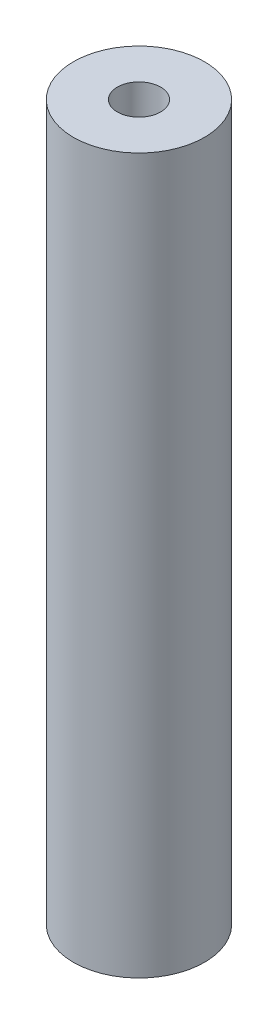
ISO-10303-21;
HEADER;
FILE_DESCRIPTION(('STEP AP214'),'2;1');
FILE_NAME('part.step','',(''),(''),'','','');
FILE_SCHEMA(('AUTOMOTIVE_DESIGN { 1 0 10303 214 1 1 1 1 }'));
ENDSEC;
DATA;
#1=APPLICATION_CONTEXT('core data for automotive mechanical design processes');
#2=APPLICATION_PROTOCOL_DEFINITION('international standard','automotive_design',2000,#1);
#3=PRODUCT_CONTEXT('',#1,'mechanical');
#4=PRODUCT('Part','Part','',(#3));
#5=PRODUCT_RELATED_PRODUCT_CATEGORY('part','',(#4));
#6=PRODUCT_DEFINITION_FORMATION('','',#4);
#7=PRODUCT_DEFINITION_CONTEXT('part definition',#1,'design');
#8=PRODUCT_DEFINITION('design','',#6,#7);
#9=PRODUCT_DEFINITION_SHAPE('','',#8);
#10=(LENGTH_UNIT() NAMED_UNIT(*) SI_UNIT(.MILLI.,.METRE.));
#11=(NAMED_UNIT(*) PLANE_ANGLE_UNIT() SI_UNIT($,.RADIAN.));
#12=(NAMED_UNIT(*) SI_UNIT($,.STERADIAN.) SOLID_ANGLE_UNIT());
#13=UNCERTAINTY_MEASURE_WITH_UNIT(LENGTH_MEASURE(1.E-05),#10,'distance_accuracy_value','');
#14=(GEOMETRIC_REPRESENTATION_CONTEXT(3) GLOBAL_UNCERTAINTY_ASSIGNED_CONTEXT((#13)) GLOBAL_UNIT_ASSIGNED_CONTEXT((#10,
#11,#12)) REPRESENTATION_CONTEXT('',''));
#15=CARTESIAN_POINT('',(0.,0.,0.));
#16=DIRECTION('',(0.,0.,1.));
#17=DIRECTION('',(1.,0.,0.));
#18=AXIS2_PLACEMENT_3D('',#15,#16,#17);
#19=CARTESIAN_POINT('',(0.,54.5,0.));
#20=DIRECTION('',(0.,-1.,0.));
#21=DIRECTION('',(0.,0.,-1.));
#22=AXIS2_PLACEMENT_3D('',#19,#20,#21);
#23=CYLINDRICAL_SURFACE('',#22,5.);
#24=CARTESIAN_POINT('',(0.,54.5,0.));
#25=DIRECTION('',(0.,1.,0.));
#26=DIRECTION('',(0.,0.,1.));
#27=AXIS2_PLACEMENT_3D('',#24,#25,#26);
#28=CIRCLE('',#27,5.);
#29=CARTESIAN_POINT('',(0.,54.5,5.));
#30=VERTEX_POINT('',#29);
#31=EDGE_CURVE('E11',#30,#30,#28,.T.);
#32=ORIENTED_EDGE('',*,*,#31,.F.);
#33=EDGE_LOOP('',(#32));
#34=FACE_BOUND('',#33,.T.);
#35=CARTESIAN_POINT('',(0.,0.,0.));
#36=DIRECTION('',(0.,1.,0.));
#37=DIRECTION('',(0.,0.,1.));
#38=AXIS2_PLACEMENT_3D('',#35,#36,#37);
#39=CIRCLE('',#38,5.);
#40=CARTESIAN_POINT('',(0.,0.,5.));
#41=VERTEX_POINT('',#40);
#42=EDGE_CURVE('E38',#41,#41,#39,.T.);
#43=ORIENTED_EDGE('',*,*,#42,.T.);
#44=EDGE_LOOP('',(#43));
#45=FACE_BOUND('',#44,.T.);
#46=ADVANCED_FACE('F35',(#34,#45),#23,.T.);
#47=CARTESIAN_POINT('',(0.,54.5,0.));
#48=DIRECTION('',(0.,1.,0.));
#49=DIRECTION('',(0.,0.,1.));
#50=AXIS2_PLACEMENT_3D('',#47,#48,#49);
#51=PLANE('',#50);
#52=CARTESIAN_POINT('',(0.,54.5,0.));
#53=DIRECTION('',(0.,1.,0.));
#54=DIRECTION('',(0.,0.,1.));
#55=AXIS2_PLACEMENT_3D('',#52,#53,#54);
#56=CIRCLE('',#55,1.64999999999999);
#57=CARTESIAN_POINT('',(0.,54.5,1.64999999999999));
#58=VERTEX_POINT('',#57);
#59=EDGE_CURVE('E58',#58,#58,#56,.T.);
#60=ORIENTED_EDGE('',*,*,#59,.F.);
#61=EDGE_LOOP('',(#60));
#62=FACE_BOUND('',#61,.T.);
#63=ORIENTED_EDGE('',*,*,#31,.T.);
#64=EDGE_LOOP('',(#63));
#65=FACE_BOUND('',#64,.T.);
#66=ADVANCED_FACE('F77',(#62,#65),#51,.T.);
#67=CARTESIAN_POINT('',(0.,0.,0.));
#68=DIRECTION('',(0.,1.,0.));
#69=DIRECTION('',(0.,0.,1.));
#70=AXIS2_PLACEMENT_3D('',#67,#68,#69);
#71=PLANE('',#70);
#72=CARTESIAN_POINT('',(0.,0.,0.));
#73=DIRECTION('',(0.,-1.,0.));
#74=DIRECTION('',(0.,0.,-1.));
#75=AXIS2_PLACEMENT_3D('',#72,#73,#74);
#76=CIRCLE('',#75,1.64999999999999);
#77=CARTESIAN_POINT('',(0.,0.,-1.64999999999999));
#78=VERTEX_POINT('',#77);
#79=EDGE_CURVE('E59',#78,#78,#76,.T.);
#80=ORIENTED_EDGE('',*,*,#79,.F.);
#81=EDGE_LOOP('',(#80));
#82=FACE_BOUND('',#81,.T.);
#83=ORIENTED_EDGE('',*,*,#42,.F.);
#84=EDGE_LOOP('',(#83));
#85=FACE_BOUND('',#84,.T.);
#86=ADVANCED_FACE('F74',(#82,#85),#71,.F.);
#87=CARTESIAN_POINT('',(0.,39.5,0.));
#88=DIRECTION('',(0.,1.,0.));
#89=DIRECTION('',(0.,0.,1.));
#90=AXIS2_PLACEMENT_3D('',#87,#88,#89);
#91=CONICAL_SURFACE('',#90,1.64999999999999,1.02974425867665);
#92=CARTESIAN_POINT('',(0.,38.5085799786045,0.));
#93=VERTEX_POINT('',#92);
#94=VERTEX_LOOP('',#93);
#95=FACE_BOUND('',#94,.T.);
#96=CARTESIAN_POINT('',(0.,39.5,0.));
#97=DIRECTION('',(0.,1.,0.));
#98=DIRECTION('',(0.,0.,1.));
#99=AXIS2_PLACEMENT_3D('',#96,#97,#98);
#100=CIRCLE('',#99,1.64999999999999);
#101=CARTESIAN_POINT('',(0.,39.5,1.64999999999999));
#102=VERTEX_POINT('',#101);
#103=EDGE_CURVE('E62',#102,#102,#100,.T.);
#104=ORIENTED_EDGE('',*,*,#103,.T.);
#105=EDGE_LOOP('',(#104));
#106=FACE_BOUND('',#105,.T.);
#107=ADVANCED_FACE('F76',(#95,#106),#91,.F.);
#108=CARTESIAN_POINT('',(0.,54.5,0.));
#109=DIRECTION('',(0.,1.,0.));
#110=DIRECTION('',(0.,0.,1.));
#111=AXIS2_PLACEMENT_3D('',#108,#109,#110);
#112=CYLINDRICAL_SURFACE('',#111,1.64999999999999);
#113=ORIENTED_EDGE('',*,*,#103,.F.);
#114=EDGE_LOOP('',(#113));
#115=FACE_BOUND('',#114,.T.);
#116=ORIENTED_EDGE('',*,*,#59,.T.);
#117=EDGE_LOOP('',(#116));
#118=FACE_BOUND('',#117,.T.);
#119=ADVANCED_FACE('F52',(#115,#118),#112,.F.);
#120=CARTESIAN_POINT('',(0.,15.,0.));
#121=DIRECTION('',(0.,-1.,0.));
#122=DIRECTION('',(0.,0.,-1.));
#123=AXIS2_PLACEMENT_3D('',#120,#121,#122);
#124=CONICAL_SURFACE('',#123,1.64999999999999,1.02974425867665);
#125=CARTESIAN_POINT('',(0.,15.9914200213955,0.));
#126=VERTEX_POINT('',#125);
#127=VERTEX_LOOP('',#126);
#128=FACE_BOUND('',#127,.T.);
#129=CARTESIAN_POINT('',(0.,15.,0.));
#130=DIRECTION('',(0.,-1.,0.));
#131=DIRECTION('',(0.,0.,-1.));
#132=AXIS2_PLACEMENT_3D('',#129,#130,#131);
#133=CIRCLE('',#132,1.64999999999999);
#134=CARTESIAN_POINT('',(0.,15.,-1.64999999999999));
#135=VERTEX_POINT('',#134);
#136=EDGE_CURVE('E56',#135,#135,#133,.T.);
#137=ORIENTED_EDGE('',*,*,#136,.T.);
#138=EDGE_LOOP('',(#137));
#139=FACE_BOUND('',#138,.T.);
#140=ADVANCED_FACE('F48',(#128,#139),#124,.F.);
#141=CARTESIAN_POINT('',(0.,0.,0.));
#142=DIRECTION('',(0.,-1.,0.));
#143=DIRECTION('',(0.,0.,-1.));
#144=AXIS2_PLACEMENT_3D('',#141,#142,#143);
#145=CYLINDRICAL_SURFACE('',#144,1.64999999999999);
#146=ORIENTED_EDGE('',*,*,#136,.F.);
#147=EDGE_LOOP('',(#146));
#148=FACE_BOUND('',#147,.T.);
#149=ORIENTED_EDGE('',*,*,#79,.T.);
#150=EDGE_LOOP('',(#149));
#151=FACE_BOUND('',#150,.T.);
#152=ADVANCED_FACE('F51',(#148,#151),#145,.F.);
#153=CLOSED_SHELL('',(#46,#66,#86,#107,#119,#140,#152));
#154=MANIFOLD_SOLID_BREP('B2',#153);
#155=ADVANCED_BREP_SHAPE_REPRESENTATION('',(#18,#154),#14);
#156=SHAPE_DEFINITION_REPRESENTATION(#9,#155);
ENDSEC;
END-ISO-10303-21;
